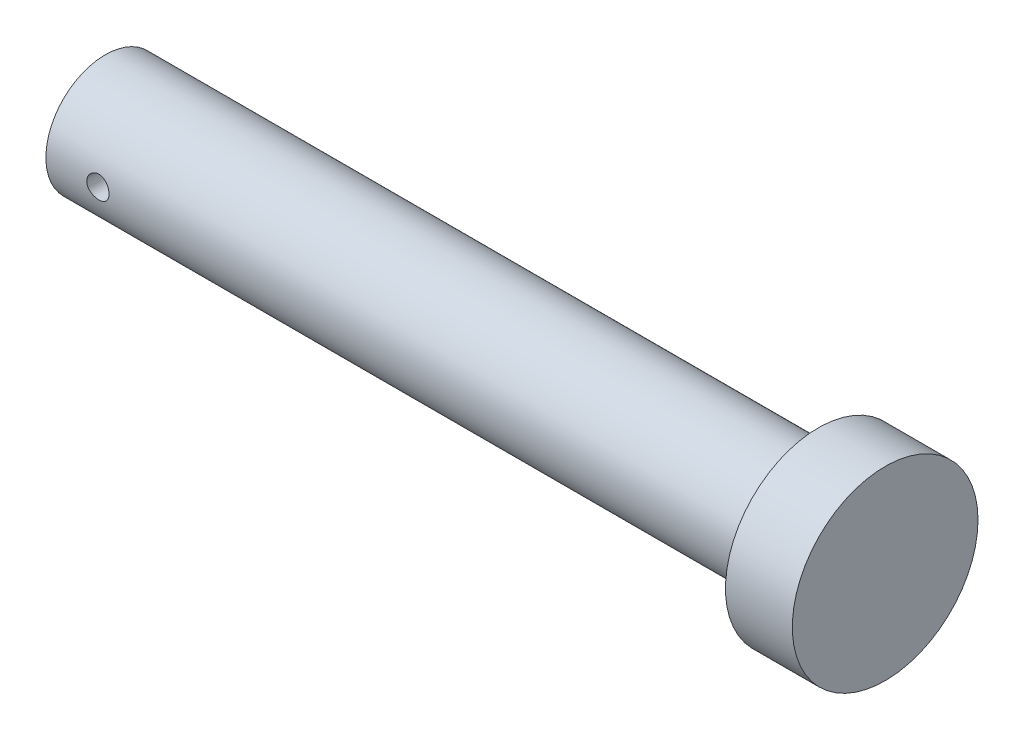
ISO-10303-21;
HEADER;
FILE_DESCRIPTION(('STEP AP214'),'2;1');
FILE_NAME('part.step','',(''),(''),'','','');
FILE_SCHEMA(('AUTOMOTIVE_DESIGN { 1 0 10303 214 1 1 1 1 }'));
ENDSEC;
DATA;
#1=APPLICATION_CONTEXT('core data for automotive mechanical design processes');
#2=APPLICATION_PROTOCOL_DEFINITION('international standard','automotive_design',2000,#1);
#3=PRODUCT_CONTEXT('',#1,'mechanical');
#4=PRODUCT('Part','Part','',(#3));
#5=PRODUCT_RELATED_PRODUCT_CATEGORY('part','',(#4));
#6=PRODUCT_DEFINITION_FORMATION('','',#4);
#7=PRODUCT_DEFINITION_CONTEXT('part definition',#1,'design');
#8=PRODUCT_DEFINITION('design','',#6,#7);
#9=PRODUCT_DEFINITION_SHAPE('','',#8);
#10=(LENGTH_UNIT() NAMED_UNIT(*) SI_UNIT(.MILLI.,.METRE.));
#11=(NAMED_UNIT(*) PLANE_ANGLE_UNIT() SI_UNIT($,.RADIAN.));
#12=(NAMED_UNIT(*) SI_UNIT($,.STERADIAN.) SOLID_ANGLE_UNIT());
#13=UNCERTAINTY_MEASURE_WITH_UNIT(LENGTH_MEASURE(1.E-05),#10,'distance_accuracy_value','');
#14=(GEOMETRIC_REPRESENTATION_CONTEXT(3) GLOBAL_UNCERTAINTY_ASSIGNED_CONTEXT((#13)) GLOBAL_UNIT_ASSIGNED_CONTEXT((#10,
#11,#12)) REPRESENTATION_CONTEXT('',''));
#15=CARTESIAN_POINT('',(0.,0.,0.));
#16=DIRECTION('',(0.,0.,1.));
#17=DIRECTION('',(1.,0.,0.));
#18=AXIS2_PLACEMENT_3D('',#15,#16,#17);
#19=CARTESIAN_POINT('',(96.,0.,0.));
#20=DIRECTION('',(-1.,0.,0.));
#21=DIRECTION('',(0.,0.,1.));
#22=AXIS2_PLACEMENT_3D('',#19,#20,#21);
#23=CYLINDRICAL_SURFACE('',#22,8.);
#24=CARTESIAN_POINT('',(8.50000000000001,0.,8.));
#25=CARTESIAN_POINT('',(8.49999681041173,-0.0834717464654705,7.99999848833852));
#26=CARTESIAN_POINT('',(8.49300892338062,-0.166984992730098,7.99868009921714));
#27=CARTESIAN_POINT('',(8.46526000488165,-0.331658129841797,7.9935478589052));
#28=CARTESIAN_POINT('',(8.44448734936026,-0.412815974152225,7.98973190166897));
#29=CARTESIAN_POINT('',(8.38982729874066,-0.570372961851802,7.98003138765458));
#30=CARTESIAN_POINT('',(8.35595174754746,-0.646776330685345,7.97414869946483));
#31=CARTESIAN_POINT('',(8.27608112307718,-0.792807973094007,7.96095710599783));
#32=CARTESIAN_POINT('',(8.23008703085518,-0.862436794477323,7.9536483161829));
#33=CARTESIAN_POINT('',(8.12670023199632,-0.993783715930503,7.93831336430504));
#34=CARTESIAN_POINT('',(8.06919055532986,-1.05540895503183,7.93028034856351));
#35=CARTESIAN_POINT('',(7.94465669091244,-1.16819606135369,7.9144531845865));
#36=CARTESIAN_POINT('',(7.87763182023071,-1.21935717689242,7.90665905354527));
#37=CARTESIAN_POINT('',(7.73531391163603,-1.31014998665793,7.89212551245005));
#38=CARTESIAN_POINT('',(7.65995962968276,-1.34968721969605,7.88539493886182));
#39=CARTESIAN_POINT('',(7.50353108482321,-1.41550524332283,7.87384713211987));
#40=CARTESIAN_POINT('',(7.42245731588878,-1.44178717713098,7.86902973396962));
#41=CARTESIAN_POINT('',(7.25788476908559,-1.480050535035,7.8619226957455));
#42=CARTESIAN_POINT('',(7.17442490279654,-1.49219390192039,7.85960445366405));
#43=CARTESIAN_POINT('',(7.00662261519175,-1.50233808095346,7.85767197152761));
#44=CARTESIAN_POINT('',(6.9222802736977,-1.50034016135374,7.8580574889876));
#45=CARTESIAN_POINT('',(6.75628047473395,-1.48238979602362,7.86146292701753));
#46=CARTESIAN_POINT('',(6.67460228569985,-1.46662149996045,7.86444808147334));
#47=CARTESIAN_POINT('',(6.51507158021739,-1.42186799396207,7.87266183284666));
#48=CARTESIAN_POINT('',(6.4372192264907,-1.39288222239499,7.87789052509516));
#49=CARTESIAN_POINT('',(6.28701132099974,-1.322336471793,7.89003855292588));
#50=CARTESIAN_POINT('',(6.21469152941919,-1.28070213532456,7.89696783823366));
#51=CARTESIAN_POINT('',(6.07799527145977,-1.18609368930416,7.91172971602918));
#52=CARTESIAN_POINT('',(6.0136196122852,-1.13311842889266,7.91956240015522));
#53=CARTESIAN_POINT('',(5.89357504432754,-1.01633905685298,7.93540001272164));
#54=CARTESIAN_POINT('',(5.83805934754826,-0.952377436860683,7.9434057102403));
#55=CARTESIAN_POINT('',(5.73852275932459,-0.815968037098827,7.95857386108318));
#56=CARTESIAN_POINT('',(5.69450198312958,-0.74352017225577,7.96573630595245));
#57=CARTESIAN_POINT('',(5.61918224612998,-0.592034988874669,7.97842539677509));
#58=CARTESIAN_POINT('',(5.5878992208821,-0.512989564446494,7.98394999136289));
#59=CARTESIAN_POINT('',(5.53909790690784,-0.350639115398697,7.99272505402719));
#60=CARTESIAN_POINT('',(5.52157815595464,-0.267334544277788,7.99597576367994));
#61=CARTESIAN_POINT('',(5.50101396898173,-0.100148652903386,7.99980360641981));
#62=CARTESIAN_POINT('',(5.49775960847027,-0.0162940126341355,8.00041950912279));
#63=CARTESIAN_POINT('',(5.50525547954765,0.150761248092184,7.99901543598228));
#64=CARTESIAN_POINT('',(5.51600502306526,0.233961900480385,7.99699558964431));
#65=CARTESIAN_POINT('',(5.55102903518337,0.396681573218217,7.99057111500406));
#66=CARTESIAN_POINT('',(5.57519728253781,0.476224261046063,7.98618522374031));
#67=CARTESIAN_POINT('',(5.63625770677878,0.630128631824633,7.97551842212498));
#68=CARTESIAN_POINT('',(5.67315074756578,0.704489962595103,7.96923738311334));
#69=CARTESIAN_POINT('',(5.75907812815951,0.846816671513213,7.95538030357666));
#70=CARTESIAN_POINT('',(5.80824073853684,0.914703277015121,7.94779086174563));
#71=CARTESIAN_POINT('',(5.91713813736236,1.04133832326454,7.93219343489712));
#72=CARTESIAN_POINT('',(5.97687391300133,1.10008590976087,7.92418541084687));
#73=CARTESIAN_POINT('',(6.10617231891143,1.20757295872048,7.9085247569745));
#74=CARTESIAN_POINT('',(6.17585490812539,1.25616916218577,7.90087825860257));
#75=CARTESIAN_POINT('',(6.32251762452375,1.34096675057787,7.88692985578532));
#76=CARTESIAN_POINT('',(6.39949748037047,1.37716859613924,7.8806279013735));
#77=CARTESIAN_POINT('',(6.55820586724253,1.43594673512823,7.87013024209574));
#78=CARTESIAN_POINT('',(6.63990937955933,1.45858868794786,7.86592440436878));
#79=CARTESIAN_POINT('',(6.8060472225214,1.48980679326235,7.86007203802415));
#80=CARTESIAN_POINT('',(6.8904812439704,1.49838453270708,7.8584252206579));
#81=CARTESIAN_POINT('',(7.05824833144151,1.50117762148355,7.85789199803857));
#82=CARTESIAN_POINT('',(7.141577580957,1.49561895003499,7.85896215974293));
#83=CARTESIAN_POINT('',(7.30609142204529,1.47079175378803,7.86364600659998));
#84=CARTESIAN_POINT('',(7.38727602642744,1.45152331089332,7.86725967655747));
#85=CARTESIAN_POINT('',(7.54507448479548,1.39991887583263,7.8766050802318));
#86=CARTESIAN_POINT('',(7.62169659134577,1.36760735397252,7.88233284594965));
#87=CARTESIAN_POINT('',(7.76846825424084,1.29085868912204,7.8952638755184));
#88=CARTESIAN_POINT('',(7.83861735284478,1.24642068948186,7.90246724360119));
#89=CARTESIAN_POINT('',(7.97158368004229,1.14589487339535,7.91767266107745));
#90=CARTESIAN_POINT('',(8.0342754125671,1.08964259864303,7.92568505353043));
#91=CARTESIAN_POINT('',(8.14940516246452,0.96742792674229,7.94152833918735));
#92=CARTESIAN_POINT('',(8.20184082098014,0.901463301891615,7.94935919027328));
#93=CARTESIAN_POINT('',(8.29541095262706,0.760984945071873,7.96403975968049));
#94=CARTESIAN_POINT('',(8.33643942849064,0.686399590640516,7.97088000990561));
#95=CARTESIAN_POINT('',(8.40531763660513,0.531290113653834,7.98271619380687));
#96=CARTESIAN_POINT('',(8.43317974704691,0.450771651705248,7.98771385879037));
#97=CARTESIAN_POINT('',(8.46927731441867,0.308347202825154,7.99428290707632));
#98=CARTESIAN_POINT('',(8.4807786303128,0.247273810251871,7.99641470878206));
#99=CARTESIAN_POINT('',(8.49614106211645,0.124141247115158,7.9992737995401));
#100=CARTESIAN_POINT('',(8.50000237225591,0.0620821016527094,8.00000112429805));
#101=CARTESIAN_POINT('',(8.50000000000001,0.,8.));
#102=B_SPLINE_CURVE_WITH_KNOTS('',3,(#24,#25,#26,#27,#28,#29,#30,#31,#32,#33,#34,#35,#36,#37,
#38,#39,#40,#41,#42,#43,#44,#45,#46,#47,#48,#49,#50,#51,#52,#53,#54,#55,#56,#57,#58,#59,#60,#61,
#62,#63,#64,#65,#66,#67,#68,#69,#70,#71,#72,#73,#74,#75,#76,#77,#78,#79,#80,#81,#82,#83,#84,#85,
#86,#87,#88,#89,#90,#91,#92,#93,#94,#95,#96,#97,#98,#99,#100,#101),.UNSPECIFIED.,.T.,.F.,(4,2,2,
2,2,2,2,2,2,2,2,2,2,2,2,2,2,2,2,2,2,2,2,2,2,2,2,2,2,2,2,2,2,2,2,2,2,2,4),(0.,0.250188200964924,
0.500587642535453,0.750761271230909,1.00091465336891,1.25375118013631,1.50660586283617,
1.76146190504358,2.01629596311949,2.26818151445336,2.52004447587256,2.76859000612766,
3.01714609846787,3.26719262629531,3.51726454049859,3.77127768464077,4.02529337544948,
4.27962588321699,4.53393136673746,4.78448174076097,5.03501980464584,5.28360233907828,
5.53220175338032,5.78351778017708,6.03485728413098,6.28953436987299,6.54420198954945,
6.79762627818559,7.05102196946513,7.30039252231748,7.54976158541507,7.79866496207693,
8.04758592655423,8.30023369966381,8.55293951262256,8.80792048916315,9.06266126931174,
9.2487434452441,9.43482089039541),.UNSPECIFIED.);
#103=CARTESIAN_POINT('',(8.50000000000001,0.,8.));
#104=VERTEX_POINT('',#103);
#105=EDGE_CURVE('E50',#104,#104,#102,.T.);
#106=ORIENTED_EDGE('',*,*,#105,.T.);
#107=EDGE_LOOP('',(#106));
#108=FACE_BOUND('',#107,.T.);
#109=CARTESIAN_POINT('',(8.5,0.,-8.));
#110=CARTESIAN_POINT('',(8.49999681041172,0.0834717464654707,-7.99999848833852));
#111=CARTESIAN_POINT('',(8.49300892338062,0.166984992730098,-7.99868009921714));
#112=CARTESIAN_POINT('',(8.46526000488165,0.331658129841798,-7.9935478589052));
#113=CARTESIAN_POINT('',(8.44448734936027,0.412815974152226,-7.98973190166897));
#114=CARTESIAN_POINT('',(8.38982729874066,0.570372961851802,-7.98003138765458));
#115=CARTESIAN_POINT('',(8.35595174754746,0.646776330685344,-7.97414869946483));
#116=CARTESIAN_POINT('',(8.27608112307718,0.792807973094007,-7.96095710599783));
#117=CARTESIAN_POINT('',(8.23008703085518,0.862436794477323,-7.9536483161829));
#118=CARTESIAN_POINT('',(8.12670023199632,0.993783715930503,-7.93831336430504));
#119=CARTESIAN_POINT('',(8.06919055532986,1.05540895503183,-7.93028034856351));
#120=CARTESIAN_POINT('',(7.94465669091244,1.16819606135369,-7.9144531845865));
#121=CARTESIAN_POINT('',(7.87763182023071,1.21935717689242,-7.90665905354527));
#122=CARTESIAN_POINT('',(7.73531391163603,1.31014998665793,-7.89212551245005));
#123=CARTESIAN_POINT('',(7.65995962968276,1.34968721969605,-7.88539493886182));
#124=CARTESIAN_POINT('',(7.50353108482321,1.41550524332283,-7.87384713211987));
#125=CARTESIAN_POINT('',(7.42245731588878,1.44178717713098,-7.86902973396962));
#126=CARTESIAN_POINT('',(7.25788476908559,1.480050535035,-7.8619226957455));
#127=CARTESIAN_POINT('',(7.17442490279653,1.49219390192039,-7.85960445366405));
#128=CARTESIAN_POINT('',(7.00662261519175,1.50233808095346,-7.85767197152761));
#129=CARTESIAN_POINT('',(6.9222802736977,1.50034016135374,-7.8580574889876));
#130=CARTESIAN_POINT('',(6.75628047473395,1.48238979602362,-7.86146292701753));
#131=CARTESIAN_POINT('',(6.67460228569985,1.46662149996045,-7.86444808147334));
#132=CARTESIAN_POINT('',(6.51507158021739,1.42186799396207,-7.87266183284666));
#133=CARTESIAN_POINT('',(6.4372192264907,1.39288222239499,-7.87789052509516));
#134=CARTESIAN_POINT('',(6.28701132099973,1.322336471793,-7.89003855292589));
#135=CARTESIAN_POINT('',(6.21469152941919,1.28070213532456,-7.89696783823366));
#136=CARTESIAN_POINT('',(6.07799527145976,1.18609368930416,-7.91172971602918));
#137=CARTESIAN_POINT('',(6.0136196122852,1.13311842889266,-7.91956240015522));
#138=CARTESIAN_POINT('',(5.89357504432754,1.01633905685298,-7.93540001272164));
#139=CARTESIAN_POINT('',(5.83805934754826,0.952377436860681,-7.94340571024031));
#140=CARTESIAN_POINT('',(5.73852275932459,0.815968037098825,-7.95857386108318));
#141=CARTESIAN_POINT('',(5.69450198312958,0.743520172255768,-7.96573630595245));
#142=CARTESIAN_POINT('',(5.61918224612998,0.592034988874666,-7.97842539677509));
#143=CARTESIAN_POINT('',(5.5878992208821,0.512989564446492,-7.98394999136289));
#144=CARTESIAN_POINT('',(5.53909790690784,0.350639115398695,-7.99272505402719));
#145=CARTESIAN_POINT('',(5.52157815595464,0.267334544277786,-7.99597576367994));
#146=CARTESIAN_POINT('',(5.50101396898173,0.100148652903384,-7.99980360641981));
#147=CARTESIAN_POINT('',(5.49775960847027,0.0162940126341344,-8.00041950912279));
#148=CARTESIAN_POINT('',(5.50525547954765,-0.150761248092185,-7.99901543598228));
#149=CARTESIAN_POINT('',(5.51600502306526,-0.233961900480386,-7.99699558964431));
#150=CARTESIAN_POINT('',(5.55102903518337,-0.396681573218218,-7.99057111500406));
#151=CARTESIAN_POINT('',(5.57519728253781,-0.476224261046064,-7.98618522374031));
#152=CARTESIAN_POINT('',(5.63625770677879,-0.630128631824634,-7.97551842212498));
#153=CARTESIAN_POINT('',(5.67315074756578,-0.704489962595104,-7.96923738311334));
#154=CARTESIAN_POINT('',(5.75907812815951,-0.846816671513215,-7.95538030357666));
#155=CARTESIAN_POINT('',(5.80824073853684,-0.914703277015122,-7.94779086174563));
#156=CARTESIAN_POINT('',(5.91713813736236,-1.04133832326455,-7.93219343489712));
#157=CARTESIAN_POINT('',(5.97687391300133,-1.10008590976087,-7.92418541084687));
#158=CARTESIAN_POINT('',(6.10617231891143,-1.20757295872048,-7.9085247569745));
#159=CARTESIAN_POINT('',(6.17585490812539,-1.25616916218577,-7.90087825860257));
#160=CARTESIAN_POINT('',(6.32251762452375,-1.34096675057787,-7.88692985578532));
#161=CARTESIAN_POINT('',(6.39949748037047,-1.37716859613924,-7.8806279013735));
#162=CARTESIAN_POINT('',(6.55820586724254,-1.43594673512823,-7.87013024209574));
#163=CARTESIAN_POINT('',(6.63990937955933,-1.45858868794786,-7.86592440436878));
#164=CARTESIAN_POINT('',(6.8060472225214,-1.48980679326236,-7.86007203802415));
#165=CARTESIAN_POINT('',(6.8904812439704,-1.49838453270708,-7.8584252206579));
#166=CARTESIAN_POINT('',(7.05824833144151,-1.50117762148355,-7.85789199803857));
#167=CARTESIAN_POINT('',(7.141577580957,-1.49561895003499,-7.85896215974293));
#168=CARTESIAN_POINT('',(7.30609142204529,-1.47079175378803,-7.86364600659998));
#169=CARTESIAN_POINT('',(7.38727602642744,-1.45152331089332,-7.86725967655747));
#170=CARTESIAN_POINT('',(7.54507448479548,-1.39991887583263,-7.8766050802318));
#171=CARTESIAN_POINT('',(7.62169659134577,-1.36760735397252,-7.88233284594965));
#172=CARTESIAN_POINT('',(7.76846825424084,-1.29085868912204,-7.8952638755184));
#173=CARTESIAN_POINT('',(7.83861735284478,-1.24642068948186,-7.90246724360119));
#174=CARTESIAN_POINT('',(7.97158368004229,-1.14589487339535,-7.91767266107745));
#175=CARTESIAN_POINT('',(8.0342754125671,-1.08964259864303,-7.92568505353043));
#176=CARTESIAN_POINT('',(8.14940516246452,-0.96742792674229,-7.94152833918735));
#177=CARTESIAN_POINT('',(8.20184082098014,-0.901463301891616,-7.94935919027328));
#178=CARTESIAN_POINT('',(8.29541095262706,-0.760984945071873,-7.96403975968049));
#179=CARTESIAN_POINT('',(8.33643942849064,-0.686399590640517,-7.97088000990561));
#180=CARTESIAN_POINT('',(8.40531763660513,-0.531290113653834,-7.98271619380687));
#181=CARTESIAN_POINT('',(8.43317974704691,-0.450771651705248,-7.98771385879037));
#182=CARTESIAN_POINT('',(8.46927731441867,-0.308347202825154,-7.99428290707632));
#183=CARTESIAN_POINT('',(8.4807786303128,-0.247273810251871,-7.99641470878206));
#184=CARTESIAN_POINT('',(8.49614106211645,-0.124141247115158,-7.9992737995401));
#185=CARTESIAN_POINT('',(8.50000237225591,-0.0620821016527095,-8.00000112429805));
#186=CARTESIAN_POINT('',(8.5,0.,-8.));
#187=B_SPLINE_CURVE_WITH_KNOTS('',3,(#109,#110,#111,#112,#113,#114,#115,#116,#117,#118,#119,
#120,#121,#122,#123,#124,#125,#126,#127,#128,#129,#130,#131,#132,#133,#134,#135,#136,#137,#138,
#139,#140,#141,#142,#143,#144,#145,#146,#147,#148,#149,#150,#151,#152,#153,#154,#155,#156,#157,
#158,#159,#160,#161,#162,#163,#164,#165,#166,#167,#168,#169,#170,#171,#172,#173,#174,#175,#176,
#177,#178,#179,#180,#181,#182,#183,#184,#185,#186),.UNSPECIFIED.,.T.,.F.,(4,2,2,2,2,2,2,2,2,2,2,
2,2,2,2,2,2,2,2,2,2,2,2,2,2,2,2,2,2,2,2,2,2,2,2,2,2,2,4),(0.,0.250188200964924,
0.500587642535453,0.750761271230908,1.00091465336891,1.25375118013631,1.50660586283617,
1.76146190504358,2.01629596311949,2.26818151445336,2.52004447587256,2.76859000612766,
3.01714609846787,3.26719262629531,3.5172645404986,3.77127768464077,4.02529337544948,
4.27962588321699,4.53393136673746,4.78448174076097,5.03501980464584,5.28360233907829,
5.53220175338032,5.78351778017709,6.03485728413099,6.28953436987299,6.54420198954945,
6.79762627818559,7.05102196946513,7.30039252231749,7.54976158541507,7.79866496207693,
8.04758592655423,8.30023369966381,8.55293951262256,8.80792048916315,9.06266126931174,
9.2487434452441,9.43482089039541),.UNSPECIFIED.);
#188=CARTESIAN_POINT('',(8.5,0.,-8.));
#189=VERTEX_POINT('',#188);
#190=EDGE_CURVE('E68',#189,#189,#187,.T.);
#191=ORIENTED_EDGE('',*,*,#190,.T.);
#192=EDGE_LOOP('',(#191));
#193=FACE_BOUND('',#192,.T.);
#194=CARTESIAN_POINT('',(96.,0.,0.));
#195=DIRECTION('',(1.,0.,0.));
#196=DIRECTION('',(0.,0.,-1.));
#197=AXIS2_PLACEMENT_3D('',#194,#195,#196);
#198=CIRCLE('',#197,8.);
#199=CARTESIAN_POINT('',(96.,0.,-8.));
#200=VERTEX_POINT('',#199);
#201=EDGE_CURVE('E12',#200,#200,#198,.T.);
#202=ORIENTED_EDGE('',*,*,#201,.F.);
#203=EDGE_LOOP('',(#202));
#204=FACE_BOUND('',#203,.T.);
#205=CARTESIAN_POINT('',(0.,0.,0.));
#206=DIRECTION('',(1.,0.,0.));
#207=DIRECTION('',(0.,0.,-1.));
#208=AXIS2_PLACEMENT_3D('',#205,#206,#207);
#209=CIRCLE('',#208,8.);
#210=CARTESIAN_POINT('',(0.,0.,-8.));
#211=VERTEX_POINT('',#210);
#212=EDGE_CURVE('E58',#211,#211,#209,.T.);
#213=ORIENTED_EDGE('',*,*,#212,.T.);
#214=EDGE_LOOP('',(#213));
#215=FACE_BOUND('',#214,.T.);
#216=ADVANCED_FACE('F46',(#108,#193,#204,#215),#23,.T.);
#217=CARTESIAN_POINT('',(0.,0.,0.));
#218=DIRECTION('',(1.,0.,0.));
#219=DIRECTION('',(0.,0.,-1.));
#220=AXIS2_PLACEMENT_3D('',#217,#218,#219);
#221=PLANE('',#220);
#222=ORIENTED_EDGE('',*,*,#212,.F.);
#223=EDGE_LOOP('',(#222));
#224=FACE_BOUND('',#223,.T.);
#225=ADVANCED_FACE('F88',(#224),#221,.F.);
#226=CARTESIAN_POINT('',(105.,0.,0.));
#227=DIRECTION('',(-1.,0.,0.));
#228=DIRECTION('',(0.,0.,1.));
#229=AXIS2_PLACEMENT_3D('',#226,#227,#228);
#230=CYLINDRICAL_SURFACE('',#229,12.5);
#231=CARTESIAN_POINT('',(105.,0.,0.));
#232=DIRECTION('',(1.,0.,0.));
#233=DIRECTION('',(0.,0.,-1.));
#234=AXIS2_PLACEMENT_3D('',#231,#232,#233);
#235=CIRCLE('',#234,12.5);
#236=CARTESIAN_POINT('',(105.,0.,-12.5));
#237=VERTEX_POINT('',#236);
#238=EDGE_CURVE('E63',#237,#237,#235,.T.);
#239=ORIENTED_EDGE('',*,*,#238,.F.);
#240=EDGE_LOOP('',(#239));
#241=FACE_BOUND('',#240,.T.);
#242=CARTESIAN_POINT('',(96.,0.,0.));
#243=DIRECTION('',(1.,0.,0.));
#244=DIRECTION('',(0.,0.,-1.));
#245=AXIS2_PLACEMENT_3D('',#242,#243,#244);
#246=CIRCLE('',#245,12.5);
#247=CARTESIAN_POINT('',(96.,0.,-12.5));
#248=VERTEX_POINT('',#247);
#249=EDGE_CURVE('E66',#248,#248,#246,.T.);
#250=ORIENTED_EDGE('',*,*,#249,.T.);
#251=EDGE_LOOP('',(#250));
#252=FACE_BOUND('',#251,.T.);
#253=ADVANCED_FACE('F83',(#241,#252),#230,.T.);
#254=CARTESIAN_POINT('',(105.,0.,0.));
#255=DIRECTION('',(1.,0.,0.));
#256=DIRECTION('',(0.,0.,-1.));
#257=AXIS2_PLACEMENT_3D('',#254,#255,#256);
#258=PLANE('',#257);
#259=ORIENTED_EDGE('',*,*,#238,.T.);
#260=EDGE_LOOP('',(#259));
#261=FACE_BOUND('',#260,.T.);
#262=ADVANCED_FACE('F79',(#261),#258,.T.);
#263=CARTESIAN_POINT('',(96.,0.,0.));
#264=DIRECTION('',(1.,0.,0.));
#265=DIRECTION('',(0.,0.,-1.));
#266=AXIS2_PLACEMENT_3D('',#263,#264,#265);
#267=PLANE('',#266);
#268=ORIENTED_EDGE('',*,*,#201,.T.);
#269=EDGE_LOOP('',(#268));
#270=FACE_BOUND('',#269,.T.);
#271=ORIENTED_EDGE('',*,*,#249,.F.);
#272=EDGE_LOOP('',(#271));
#273=FACE_BOUND('',#272,.T.);
#274=ADVANCED_FACE('F77',(#270,#273),#267,.F.);
#275=CARTESIAN_POINT('',(7.,0.,-12.5));
#276=DIRECTION('',(0.,0.,1.));
#277=DIRECTION('',(1.,0.,0.));
#278=AXIS2_PLACEMENT_3D('',#275,#276,#277);
#279=CYLINDRICAL_SURFACE('',#278,1.5);
#280=ORIENTED_EDGE('',*,*,#190,.F.);
#281=EDGE_LOOP('',(#280));
#282=FACE_BOUND('',#281,.T.);
#283=ORIENTED_EDGE('',*,*,#105,.F.);
#284=EDGE_LOOP('',(#283));
#285=FACE_BOUND('',#284,.T.);
#286=ADVANCED_FACE('F73',(#282,#285),#279,.F.);
#287=CLOSED_SHELL('',(#216,#225,#253,#262,#274,#286));
#288=MANIFOLD_SOLID_BREP('B2',#287);
#289=ADVANCED_BREP_SHAPE_REPRESENTATION('',(#18,#288),#14);
#290=SHAPE_DEFINITION_REPRESENTATION(#9,#289);
ENDSEC;
END-ISO-10303-21;
